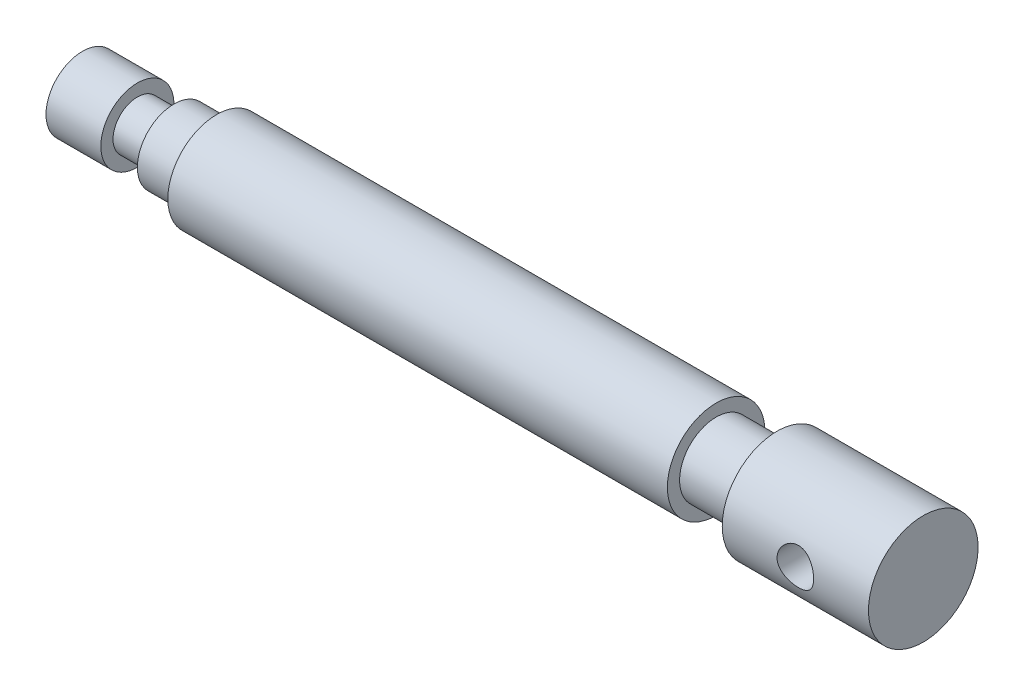
ISO-10303-21;
HEADER;
FILE_DESCRIPTION(('STEP AP214'),'2;1');
FILE_NAME('part.step','',(''),(''),'','','');
FILE_SCHEMA(('AUTOMOTIVE_DESIGN { 1 0 10303 214 1 1 1 1 }'));
ENDSEC;
DATA;
#1=APPLICATION_CONTEXT('core data for automotive mechanical design processes');
#2=APPLICATION_PROTOCOL_DEFINITION('international standard','automotive_design',2000,#1);
#3=PRODUCT_CONTEXT('',#1,'mechanical');
#4=PRODUCT('Part','Part','',(#3));
#5=PRODUCT_RELATED_PRODUCT_CATEGORY('part','',(#4));
#6=PRODUCT_DEFINITION_FORMATION('','',#4);
#7=PRODUCT_DEFINITION_CONTEXT('part definition',#1,'design');
#8=PRODUCT_DEFINITION('design','',#6,#7);
#9=PRODUCT_DEFINITION_SHAPE('','',#8);
#10=(LENGTH_UNIT() NAMED_UNIT(*) SI_UNIT(.MILLI.,.METRE.));
#11=(NAMED_UNIT(*) PLANE_ANGLE_UNIT() SI_UNIT($,.RADIAN.));
#12=(NAMED_UNIT(*) SI_UNIT($,.STERADIAN.) SOLID_ANGLE_UNIT());
#13=UNCERTAINTY_MEASURE_WITH_UNIT(LENGTH_MEASURE(1.E-05),#10,'distance_accuracy_value','');
#14=(GEOMETRIC_REPRESENTATION_CONTEXT(3) GLOBAL_UNCERTAINTY_ASSIGNED_CONTEXT((#13)) GLOBAL_UNIT_ASSIGNED_CONTEXT((#10,
#11,#12)) REPRESENTATION_CONTEXT('',''));
#15=CARTESIAN_POINT('',(0.,0.,0.));
#16=DIRECTION('',(0.,0.,1.));
#17=DIRECTION('',(1.,0.,0.));
#18=AXIS2_PLACEMENT_3D('',#15,#16,#17);
#19=CARTESIAN_POINT('',(69.,0.,0.));
#20=DIRECTION('',(-1.,0.,0.));
#21=DIRECTION('',(0.,0.,1.));
#22=AXIS2_PLACEMENT_3D('',#19,#20,#21);
#23=PLANE('',#22);
#24=CARTESIAN_POINT('',(69.,0.,0.));
#25=DIRECTION('',(-1.,0.,0.));
#26=DIRECTION('',(0.,0.,1.));
#27=AXIS2_PLACEMENT_3D('',#24,#25,#26);
#28=CIRCLE('',#27,9.);
#29=CARTESIAN_POINT('',(69.,0.,9.));
#30=VERTEX_POINT('',#29);
#31=EDGE_CURVE('E49',#30,#30,#28,.T.);
#32=ORIENTED_EDGE('',*,*,#31,.F.);
#33=EDGE_LOOP('',(#32));
#34=FACE_BOUND('',#33,.T.);
#35=ADVANCED_FACE('F35',(#34),#23,.F.);
#36=CARTESIAN_POINT('',(0.,0.,0.));
#37=DIRECTION('',(-1.,0.,0.));
#38=DIRECTION('',(0.,0.,1.));
#39=AXIS2_PLACEMENT_3D('',#36,#37,#38);
#40=CYLINDRICAL_SURFACE('',#39,9.);
#41=CARTESIAN_POINT('',(60.,0.,-9.));
#42=CARTESIAN_POINT('',(60.0000007611949,0.16369008866017,-9.00000045902832));
#43=CARTESIAN_POINT('',(59.9865592016184,0.32737558361565,-8.99549308522634));
#44=CARTESIAN_POINT('',(59.9333126735484,0.649925282618917,-8.97795630609842));
#45=CARTESIAN_POINT('',(59.8935049681532,0.808788984356453,-8.96492601606457));
#46=CARTESIAN_POINT('',(59.7890422698479,1.11699836850533,-8.93175923719327));
#47=CARTESIAN_POINT('',(59.7244288126222,1.2663594776581,-8.9116346319256));
#48=CARTESIAN_POINT('',(59.572376481485,1.55212481041597,-8.86633337152025));
#49=CARTESIAN_POINT('',(59.4849331049922,1.68852647087611,-8.84115572003334));
#50=CARTESIAN_POINT('',(59.2865225854238,1.9492250250668,-8.78742283329015));
#51=CARTESIAN_POINT('',(59.1749062972185,2.07301110089493,-8.75878669391354));
#52=CARTESIAN_POINT('',(58.9326985358803,2.30049807810625,-8.70180944349364));
#53=CARTESIAN_POINT('',(58.8021028952145,2.40419455646839,-8.67346839871647));
#54=CARTESIAN_POINT('',(58.5210446544106,2.59147482668358,-8.61939997431821));
#55=CARTESIAN_POINT('',(58.3701187808036,2.6743945746631,-8.59377117827064));
#56=CARTESIAN_POINT('',(58.0554717166244,2.81345662163317,-8.54925916255803));
#57=CARTESIAN_POINT('',(57.8917544485118,2.8696070921603,-8.53037388482237));
#58=CARTESIAN_POINT('',(57.5619803355099,2.95162038452749,-8.50233909808131));
#59=CARTESIAN_POINT('',(57.3961883745328,2.97844034481531,-8.49288287308833));
#60=CARTESIAN_POINT('',(57.0622087375324,3.00402337000343,-8.48386969888522));
#61=CARTESIAN_POINT('',(56.8940218178724,3.00279510481416,-8.4843096906819));
#62=CARTESIAN_POINT('',(56.5681901086679,2.97305971111026,-8.4947704502454));
#63=CARTESIAN_POINT('',(56.4104147912429,2.94580173950099,-8.50435247602598));
#64=CARTESIAN_POINT('',(56.1018197411795,2.86681848854825,-8.53129973173652));
#65=CARTESIAN_POINT('',(55.9510008436948,2.81509027977561,-8.54866589352322));
#66=CARTESIAN_POINT('',(55.6577617512256,2.68781717418064,-8.58953733393746));
#67=CARTESIAN_POINT('',(55.5155159235914,2.61190214612179,-8.61313697379351));
#68=CARTESIAN_POINT('',(55.2453872751608,2.43866731890942,-8.66377675727179));
#69=CARTESIAN_POINT('',(55.1175086191999,2.34134133709202,-8.6908178937139));
#70=CARTESIAN_POINT('',(54.8727252055177,2.12204799804671,-8.74701987503222));
#71=CARTESIAN_POINT('',(54.7567419164728,1.99905945022893,-8.77621768064528));
#72=CARTESIAN_POINT('',(54.5468062000098,1.73501870991019,-8.8322081516111));
#73=CARTESIAN_POINT('',(54.4528558855065,1.59396478698245,-8.85900058614202));
#74=CARTESIAN_POINT('',(54.2889110992948,1.29584283913881,-8.90751323813381));
#75=CARTESIAN_POINT('',(54.2191635259778,1.13862982924901,-8.92918050024117));
#76=CARTESIAN_POINT('',(54.1073904781329,0.813807250093527,-8.96461701433304));
#77=CARTESIAN_POINT('',(54.0653553737297,0.646201314464864,-8.97838900964637));
#78=CARTESIAN_POINT('',(54.0118330019329,0.313151488587914,-8.99602881214321));
#79=CARTESIAN_POINT('',(53.9991005724818,0.14792879959454,-9.00030005501184));
#80=CARTESIAN_POINT('',(54.0009980207954,-0.182325209880711,-8.99966708084482));
#81=CARTESIAN_POINT('',(54.0156232799396,-0.347356557958951,-8.99476441258087));
#82=CARTESIAN_POINT('',(54.0708357232079,-0.667559598912766,-8.97660074151313));
#83=CARTESIAN_POINT('',(54.1106586181485,-0.82287842050453,-8.96358596133577));
#84=CARTESIAN_POINT('',(54.2141803334002,-1.12456787573872,-8.9307554049021));
#85=CARTESIAN_POINT('',(54.2778821984034,-1.27093736552582,-8.91093876140025));
#86=CARTESIAN_POINT('',(54.4292112955224,-1.55486488917982,-8.86586793861869));
#87=CARTESIAN_POINT('',(54.5174237798495,-1.69208987765144,-8.84048444267358));
#88=CARTESIAN_POINT('',(54.7145824500405,-1.95019449040676,-8.78715761748787));
#89=CARTESIAN_POINT('',(54.8235349680953,-2.07106910338673,-8.75921350781482));
#90=CARTESIAN_POINT('',(55.0649362530198,-2.2987575234189,-8.70230543941334));
#91=CARTESIAN_POINT('',(55.1982276807806,-2.40468290773731,-8.67335283262283));
#92=CARTESIAN_POINT('',(55.4813147034327,-2.59277256697072,-8.61899919884126));
#93=CARTESIAN_POINT('',(55.6311104359022,-2.67493664379304,-8.59359820146007));
#94=CARTESIAN_POINT('',(55.9430190458697,-2.81279079124908,-8.5494717537415));
#95=CARTESIAN_POINT('',(56.1051062375063,-2.86853439649506,-8.53073282378936));
#96=CARTESIAN_POINT('',(56.4371359501324,-2.95168400027807,-8.50232496919348));
#97=CARTESIAN_POINT('',(56.6070748962131,-2.97910276486182,-8.49265195870918));
#98=CARTESIAN_POINT('',(56.9405912881228,-3.00382884743203,-8.48393576622531));
#99=CARTESIAN_POINT('',(57.1040470208605,-3.0026107719252,-8.48437200772245));
#100=CARTESIAN_POINT('',(57.4282952247662,-2.97372688034608,-8.49453809471602));
#101=CARTESIAN_POINT('',(57.5890878538653,-2.94606263837576,-8.50426738708084));
#102=CARTESIAN_POINT('',(57.9004069890074,-2.86611543938804,-8.53153572914675));
#103=CARTESIAN_POINT('',(58.0510704750135,-2.81431003804654,-8.54892294067432));
#104=CARTESIAN_POINT('',(58.3416822208148,-2.68793809727924,-8.58949196455405));
#105=CARTESIAN_POINT('',(58.481628093564,-2.61336650566142,-8.61267506290179));
#106=CARTESIAN_POINT('',(58.7534510097687,-2.43978207775029,-8.66348487678138));
#107=CARTESIAN_POINT('',(58.8847095056952,-2.33984472829374,-8.69126134926411));
#108=CARTESIAN_POINT('',(59.1290694401526,-2.11992864940694,-8.74750068849758));
#109=CARTESIAN_POINT('',(59.2421657270642,-1.99994425335444,-8.77596374737117));
#110=CARTESIAN_POINT('',(59.4514332368675,-1.73772467076207,-8.83170091576632));
#111=CARTESIAN_POINT('',(59.546773043253,-1.59480454049919,-8.8588854540377));
#112=CARTESIAN_POINT('',(59.711971286552,-1.29407207221988,-8.90777973517836));
#113=CARTESIAN_POINT('',(59.7818362377661,-1.13626355439705,-8.92949087723789));
#114=CARTESIAN_POINT('',(59.891164897466,-0.817480941602932,-8.96416545205625));
#115=CARTESIAN_POINT('',(59.9318473987901,-0.656963273029229,-8.97747637267568));
#116=CARTESIAN_POINT('',(59.9862608420314,-0.330961248030742,-8.99539221192665));
#117=CARTESIAN_POINT('',(59.9999992304896,-0.16547827670624,-8.99999953595714));
#118=CARTESIAN_POINT('',(60.,0.,-9.));
#119=B_SPLINE_CURVE_WITH_KNOTS('',3,(#41,#42,#43,#44,#45,#46,#47,#48,#49,#50,#51,#52,#53,#54,
#55,#56,#57,#58,#59,#60,#61,#62,#63,#64,#65,#66,#67,#68,#69,#70,#71,#72,#73,#74,#75,#76,#77,#78,
#79,#80,#81,#82,#83,#84,#85,#86,#87,#88,#89,#90,#91,#92,#93,#94,#95,#96,#97,#98,#99,#100,#101,
#102,#103,#104,#105,#106,#107,#108,#109,#110,#111,#112,#113,#114,#115,#116,#117,#118),
.UNSPECIFIED.,.T.,.F.,(4,2,2,2,2,2,2,2,2,2,2,2,2,2,2,2,2,2,2,2,2,2,2,2,2,2,2,2,2,2,2,2,2,2,2,2,
2,2,4),(0.,0.490461318078033,0.980973555802562,1.47066801861082,1.9604591333973,
2.46554052848268,2.97073299862591,3.49045154470412,4.010011340785,4.51205777225521,
5.01394901962457,5.49290479653841,5.97191792566446,6.45864513465392,6.94551307674622,
7.45779917434101,7.97013437899855,8.48755216951072,9.00479006631625,9.49960749525509,
9.9943413949253,10.4747447393464,10.9552093585231,11.4483119953121,11.9415654246567,
12.4572306864226,12.9729002470499,13.4875204148031,14.0019085411752,14.4898699819278,
14.9778023805413,15.4564676124125,15.9352391452793,16.4349020007541,16.9347063337134,
17.453989825053,17.9731404345737,18.4690967512144,18.9649159811442),.UNSPECIFIED.);
#120=CARTESIAN_POINT('',(60.,0.,-9.));
#121=VERTEX_POINT('',#120);
#122=EDGE_CURVE('E10',#121,#121,#119,.T.);
#123=ORIENTED_EDGE('',*,*,#122,.T.);
#124=EDGE_LOOP('',(#123));
#125=FACE_BOUND('',#124,.T.);
#126=CARTESIAN_POINT('',(60.,0.,9.));
#127=CARTESIAN_POINT('',(60.0000007611949,-0.16369008866017,9.00000045902832));
#128=CARTESIAN_POINT('',(59.9865592016184,-0.327375583615649,8.99549308522634));
#129=CARTESIAN_POINT('',(59.9333126735484,-0.649925282618916,8.97795630609842));
#130=CARTESIAN_POINT('',(59.8935049681532,-0.808788984356453,8.96492601606457));
#131=CARTESIAN_POINT('',(59.7890422698479,-1.11699836850533,8.93175923719328));
#132=CARTESIAN_POINT('',(59.7244288126222,-1.2663594776581,8.9116346319256));
#133=CARTESIAN_POINT('',(59.572376481485,-1.55212481041597,8.86633337152025));
#134=CARTESIAN_POINT('',(59.4849331049922,-1.68852647087611,8.84115572003334));
#135=CARTESIAN_POINT('',(59.2865225854238,-1.9492250250668,8.78742283329015));
#136=CARTESIAN_POINT('',(59.1749062972185,-2.07301110089493,8.75878669391354));
#137=CARTESIAN_POINT('',(58.9326985358803,-2.30049807810625,8.70180944349364));
#138=CARTESIAN_POINT('',(58.8021028952145,-2.40419455646839,8.67346839871647));
#139=CARTESIAN_POINT('',(58.5210446544106,-2.59147482668358,8.61939997431821));
#140=CARTESIAN_POINT('',(58.3701187808036,-2.6743945746631,8.59377117827064));
#141=CARTESIAN_POINT('',(58.0554717166244,-2.81345662163317,8.54925916255803));
#142=CARTESIAN_POINT('',(57.8917544485118,-2.8696070921603,8.53037388482237));
#143=CARTESIAN_POINT('',(57.5619803355099,-2.95162038452749,8.50233909808131));
#144=CARTESIAN_POINT('',(57.3961883745328,-2.97844034481531,8.49288287308833));
#145=CARTESIAN_POINT('',(57.0622087375324,-3.00402337000343,8.48386969888522));
#146=CARTESIAN_POINT('',(56.8940218178724,-3.00279510481416,8.4843096906819));
#147=CARTESIAN_POINT('',(56.5681901086679,-2.97305971111026,8.4947704502454));
#148=CARTESIAN_POINT('',(56.4104147912429,-2.94580173950099,8.50435247602598));
#149=CARTESIAN_POINT('',(56.1018197411795,-2.86681848854825,8.53129973173652));
#150=CARTESIAN_POINT('',(55.9510008436948,-2.81509027977561,8.54866589352322));
#151=CARTESIAN_POINT('',(55.6577617512256,-2.68781717418064,8.58953733393746));
#152=CARTESIAN_POINT('',(55.5155159235914,-2.61190214612179,8.61313697379351));
#153=CARTESIAN_POINT('',(55.2453872751608,-2.43866731890942,8.66377675727179));
#154=CARTESIAN_POINT('',(55.1175086191999,-2.34134133709202,8.6908178937139));
#155=CARTESIAN_POINT('',(54.8727252055177,-2.12204799804671,8.74701987503222));
#156=CARTESIAN_POINT('',(54.7567419164728,-1.99905945022893,8.77621768064528));
#157=CARTESIAN_POINT('',(54.5468062000098,-1.73501870991019,8.8322081516111));
#158=CARTESIAN_POINT('',(54.4528558855065,-1.59396478698245,8.85900058614202));
#159=CARTESIAN_POINT('',(54.2889110992948,-1.29584283913881,8.90751323813381));
#160=CARTESIAN_POINT('',(54.2191635259778,-1.13862982924901,8.92918050024117));
#161=CARTESIAN_POINT('',(54.1073904781329,-0.813807250093527,8.96461701433304));
#162=CARTESIAN_POINT('',(54.0653553737297,-0.646201314464865,8.97838900964637));
#163=CARTESIAN_POINT('',(54.0118330019329,-0.313151488587915,8.99602881214321));
#164=CARTESIAN_POINT('',(53.9991005724818,-0.147928799594541,9.00030005501184));
#165=CARTESIAN_POINT('',(54.0009980207954,0.182325209880711,8.99966708084482));
#166=CARTESIAN_POINT('',(54.0156232799396,0.34735655795895,8.99476441258087));
#167=CARTESIAN_POINT('',(54.0708357232079,0.667559598912765,8.97660074151313));
#168=CARTESIAN_POINT('',(54.1106586181485,0.822878420504529,8.96358596133577));
#169=CARTESIAN_POINT('',(54.2141803334002,1.12456787573872,8.9307554049021));
#170=CARTESIAN_POINT('',(54.2778821984034,1.27093736552582,8.91093876140025));
#171=CARTESIAN_POINT('',(54.4292112955224,1.55486488917982,8.86586793861869));
#172=CARTESIAN_POINT('',(54.5174237798495,1.69208987765144,8.84048444267358));
#173=CARTESIAN_POINT('',(54.7145824500405,1.95019449040676,8.78715761748787));
#174=CARTESIAN_POINT('',(54.8235349680953,2.07106910338673,8.75921350781483));
#175=CARTESIAN_POINT('',(55.0649362530198,2.2987575234189,8.70230543941334));
#176=CARTESIAN_POINT('',(55.1982276807806,2.40468290773731,8.67335283262283));
#177=CARTESIAN_POINT('',(55.4813147034327,2.59277256697072,8.61899919884126));
#178=CARTESIAN_POINT('',(55.6311104359022,2.67493664379304,8.59359820146007));
#179=CARTESIAN_POINT('',(55.9430190458697,2.81279079124908,8.5494717537415));
#180=CARTESIAN_POINT('',(56.1051062375063,2.86853439649506,8.53073282378936));
#181=CARTESIAN_POINT('',(56.4371359501324,2.95168400027807,8.50232496919348));
#182=CARTESIAN_POINT('',(56.6070748962131,2.97910276486182,8.49265195870918));
#183=CARTESIAN_POINT('',(56.9405912881228,3.00382884743203,8.48393576622531));
#184=CARTESIAN_POINT('',(57.1040470208605,3.0026107719252,8.48437200772245));
#185=CARTESIAN_POINT('',(57.4282952247662,2.97372688034608,8.49453809471602));
#186=CARTESIAN_POINT('',(57.5890878538653,2.94606263837576,8.50426738708084));
#187=CARTESIAN_POINT('',(57.9004069890074,2.86611543938804,8.53153572914675));
#188=CARTESIAN_POINT('',(58.0510704750135,2.81431003804654,8.54892294067432));
#189=CARTESIAN_POINT('',(58.3416822208148,2.68793809727924,8.58949196455405));
#190=CARTESIAN_POINT('',(58.481628093564,2.61336650566142,8.61267506290179));
#191=CARTESIAN_POINT('',(58.7534510097687,2.43978207775029,8.66348487678138));
#192=CARTESIAN_POINT('',(58.8847095056952,2.33984472829374,8.69126134926411));
#193=CARTESIAN_POINT('',(59.1290694401526,2.11992864940694,8.74750068849758));
#194=CARTESIAN_POINT('',(59.2421657270642,1.99994425335444,8.77596374737117));
#195=CARTESIAN_POINT('',(59.4514332368675,1.73772467076207,8.83170091576632));
#196=CARTESIAN_POINT('',(59.546773043253,1.59480454049919,8.8588854540377));
#197=CARTESIAN_POINT('',(59.711971286552,1.29407207221988,8.90777973517836));
#198=CARTESIAN_POINT('',(59.7818362377661,1.13626355439705,8.92949087723789));
#199=CARTESIAN_POINT('',(59.891164897466,0.817480941602932,8.96416545205625));
#200=CARTESIAN_POINT('',(59.9318473987901,0.656963273029229,8.97747637267568));
#201=CARTESIAN_POINT('',(59.9862608420314,0.330961248030742,8.99539221192665));
#202=CARTESIAN_POINT('',(59.9999992304896,0.16547827670624,8.99999953595715));
#203=CARTESIAN_POINT('',(60.,0.,9.));
#204=B_SPLINE_CURVE_WITH_KNOTS('',3,(#126,#127,#128,#129,#130,#131,#132,#133,#134,#135,#136,
#137,#138,#139,#140,#141,#142,#143,#144,#145,#146,#147,#148,#149,#150,#151,#152,#153,#154,#155,
#156,#157,#158,#159,#160,#161,#162,#163,#164,#165,#166,#167,#168,#169,#170,#171,#172,#173,#174,
#175,#176,#177,#178,#179,#180,#181,#182,#183,#184,#185,#186,#187,#188,#189,#190,#191,#192,#193,
#194,#195,#196,#197,#198,#199,#200,#201,#202,#203),.UNSPECIFIED.,.T.,.F.,(4,2,2,2,2,2,2,2,2,2,2,
2,2,2,2,2,2,2,2,2,2,2,2,2,2,2,2,2,2,2,2,2,2,2,2,2,2,2,4),(0.,0.490461318078033,
0.980973555802562,1.47066801861082,1.9604591333973,2.46554052848268,2.97073299862591,
3.49045154470412,4.010011340785,4.51205777225521,5.01394901962457,5.49290479653841,
5.97191792566446,6.45864513465392,6.94551307674622,7.45779917434101,7.97013437899855,
8.48755216951073,9.00479006631625,9.49960749525509,9.9943413949253,10.4747447393464,
10.9552093585231,11.4483119953121,11.9415654246567,12.4572306864226,12.9729002470499,
13.4875204148031,14.0019085411752,14.4898699819278,14.9778023805413,15.4564676124125,
15.9352391452793,16.4349020007541,16.9347063337134,17.453989825053,17.9731404345737,
18.4690967512144,18.9649159811442),.UNSPECIFIED.);
#205=CARTESIAN_POINT('',(60.,0.,9.));
#206=VERTEX_POINT('',#205);
#207=EDGE_CURVE('E45',#206,#206,#204,.T.);
#208=ORIENTED_EDGE('',*,*,#207,.T.);
#209=EDGE_LOOP('',(#208));
#210=FACE_BOUND('',#209,.T.);
#211=CARTESIAN_POINT('',(45.,0.,0.));
#212=DIRECTION('',(-1.,0.,0.));
#213=DIRECTION('',(0.,0.,1.));
#214=AXIS2_PLACEMENT_3D('',#211,#212,#213);
#215=CIRCLE('',#214,9.);
#216=CARTESIAN_POINT('',(45.,0.,9.));
#217=VERTEX_POINT('',#216);
#218=EDGE_CURVE('E53',#217,#217,#215,.T.);
#219=ORIENTED_EDGE('',*,*,#218,.F.);
#220=EDGE_LOOP('',(#219));
#221=FACE_BOUND('',#220,.T.);
#222=ORIENTED_EDGE('',*,*,#31,.T.);
#223=EDGE_LOOP('',(#222));
#224=FACE_BOUND('',#223,.T.);
#225=ADVANCED_FACE('F59',(#125,#210,#221,#224),#40,.T.);
#226=CARTESIAN_POINT('',(45.,0.,-9.));
#227=DIRECTION('',(1.,0.,0.));
#228=DIRECTION('',(0.,0.,-1.));
#229=AXIS2_PLACEMENT_3D('',#226,#227,#228);
#230=PLANE('',#229);
#231=CARTESIAN_POINT('',(45.,0.,0.));
#232=DIRECTION('',(-1.,0.,0.));
#233=DIRECTION('',(0.,0.,1.));
#234=AXIS2_PLACEMENT_3D('',#231,#232,#233);
#235=CIRCLE('',#234,6.);
#236=CARTESIAN_POINT('',(45.,0.,6.));
#237=VERTEX_POINT('',#236);
#238=EDGE_CURVE('E230',#237,#237,#235,.T.);
#239=ORIENTED_EDGE('',*,*,#238,.F.);
#240=EDGE_LOOP('',(#239));
#241=FACE_BOUND('',#240,.T.);
#242=ORIENTED_EDGE('',*,*,#218,.T.);
#243=EDGE_LOOP('',(#242));
#244=FACE_BOUND('',#243,.T.);
#245=ADVANCED_FACE('F106',(#241,#244),#230,.F.);
#246=CARTESIAN_POINT('',(0.,0.,0.));
#247=DIRECTION('',(-1.,0.,0.));
#248=DIRECTION('',(0.,0.,1.));
#249=AXIS2_PLACEMENT_3D('',#246,#247,#248);
#250=CYLINDRICAL_SURFACE('',#249,6.);
#251=CARTESIAN_POINT('',(35.,0.,0.));
#252=DIRECTION('',(-1.,0.,0.));
#253=DIRECTION('',(0.,0.,1.));
#254=AXIS2_PLACEMENT_3D('',#251,#252,#253);
#255=CIRCLE('',#254,6.);
#256=CARTESIAN_POINT('',(35.,0.,6.));
#257=VERTEX_POINT('',#256);
#258=EDGE_CURVE('E234',#257,#257,#255,.T.);
#259=ORIENTED_EDGE('',*,*,#258,.F.);
#260=EDGE_LOOP('',(#259));
#261=FACE_BOUND('',#260,.T.);
#262=ORIENTED_EDGE('',*,*,#238,.T.);
#263=EDGE_LOOP('',(#262));
#264=FACE_BOUND('',#263,.T.);
#265=ADVANCED_FACE('F103',(#261,#264),#250,.T.);
#266=CARTESIAN_POINT('',(35.,0.,-6.));
#267=DIRECTION('',(-1.,0.,0.));
#268=DIRECTION('',(0.,0.,1.));
#269=AXIS2_PLACEMENT_3D('',#266,#267,#268);
#270=PLANE('',#269);
#271=CARTESIAN_POINT('',(35.,0.,0.));
#272=DIRECTION('',(-1.,0.,0.));
#273=DIRECTION('',(0.,0.,1.));
#274=AXIS2_PLACEMENT_3D('',#271,#272,#273);
#275=CIRCLE('',#274,8.);
#276=CARTESIAN_POINT('',(35.,0.,8.));
#277=VERTEX_POINT('',#276);
#278=EDGE_CURVE('E239',#277,#277,#275,.T.);
#279=ORIENTED_EDGE('',*,*,#278,.F.);
#280=EDGE_LOOP('',(#279));
#281=FACE_BOUND('',#280,.T.);
#282=ORIENTED_EDGE('',*,*,#258,.T.);
#283=EDGE_LOOP('',(#282));
#284=FACE_BOUND('',#283,.T.);
#285=ADVANCED_FACE('F99',(#281,#284),#270,.F.);
#286=CARTESIAN_POINT('',(0.,0.,0.));
#287=DIRECTION('',(-1.,0.,0.));
#288=DIRECTION('',(0.,0.,1.));
#289=AXIS2_PLACEMENT_3D('',#286,#287,#288);
#290=CYLINDRICAL_SURFACE('',#289,7.99999999999999);
#291=CARTESIAN_POINT('',(-47.,0.,0.));
#292=DIRECTION('',(-1.,0.,0.));
#293=DIRECTION('',(0.,0.,1.));
#294=AXIS2_PLACEMENT_3D('',#291,#292,#293);
#295=CIRCLE('',#294,7.99999999999999);
#296=CARTESIAN_POINT('',(-47.,0.,7.99999999999999));
#297=VERTEX_POINT('',#296);
#298=EDGE_CURVE('E242',#297,#297,#295,.T.);
#299=ORIENTED_EDGE('',*,*,#298,.F.);
#300=EDGE_LOOP('',(#299));
#301=FACE_BOUND('',#300,.T.);
#302=ORIENTED_EDGE('',*,*,#278,.T.);
#303=EDGE_LOOP('',(#302));
#304=FACE_BOUND('',#303,.T.);
#305=ADVANCED_FACE('F95',(#301,#304),#290,.T.);
#306=CARTESIAN_POINT('',(-47.,0.,-7.99999999999999));
#307=DIRECTION('',(1.,0.,0.));
#308=DIRECTION('',(0.,0.,-1.));
#309=AXIS2_PLACEMENT_3D('',#306,#307,#308);
#310=PLANE('',#309);
#311=CARTESIAN_POINT('',(-47.,0.,0.));
#312=DIRECTION('',(-1.,0.,0.));
#313=DIRECTION('',(0.,0.,1.));
#314=AXIS2_PLACEMENT_3D('',#311,#312,#313);
#315=CIRCLE('',#314,6.);
#316=CARTESIAN_POINT('',(-47.,0.,6.));
#317=VERTEX_POINT('',#316);
#318=EDGE_CURVE('E245',#317,#317,#315,.T.);
#319=ORIENTED_EDGE('',*,*,#318,.F.);
#320=EDGE_LOOP('',(#319));
#321=FACE_BOUND('',#320,.T.);
#322=ORIENTED_EDGE('',*,*,#298,.T.);
#323=EDGE_LOOP('',(#322));
#324=FACE_BOUND('',#323,.T.);
#325=ADVANCED_FACE('F91',(#321,#324),#310,.F.);
#326=CARTESIAN_POINT('',(0.,0.,0.));
#327=DIRECTION('',(-1.,0.,0.));
#328=DIRECTION('',(0.,0.,1.));
#329=AXIS2_PLACEMENT_3D('',#326,#327,#328);
#330=CYLINDRICAL_SURFACE('',#329,6.);
#331=CARTESIAN_POINT('',(-54.,0.,0.));
#332=DIRECTION('',(-1.,0.,0.));
#333=DIRECTION('',(0.,0.,1.));
#334=AXIS2_PLACEMENT_3D('',#331,#332,#333);
#335=CIRCLE('',#334,6.);
#336=CARTESIAN_POINT('',(-54.,0.,6.));
#337=VERTEX_POINT('',#336);
#338=EDGE_CURVE('E248',#337,#337,#335,.T.);
#339=ORIENTED_EDGE('',*,*,#338,.F.);
#340=EDGE_LOOP('',(#339));
#341=FACE_BOUND('',#340,.T.);
#342=ORIENTED_EDGE('',*,*,#318,.T.);
#343=EDGE_LOOP('',(#342));
#344=FACE_BOUND('',#343,.T.);
#345=ADVANCED_FACE('F87',(#341,#344),#330,.T.);
#346=CARTESIAN_POINT('',(-54.,0.,-6.));
#347=DIRECTION('',(1.,0.,0.));
#348=DIRECTION('',(0.,0.,-1.));
#349=AXIS2_PLACEMENT_3D('',#346,#347,#348);
#350=PLANE('',#349);
#351=CARTESIAN_POINT('',(-54.,0.,0.));
#352=DIRECTION('',(-1.,0.,0.));
#353=DIRECTION('',(0.,0.,1.));
#354=AXIS2_PLACEMENT_3D('',#351,#352,#353);
#355=CIRCLE('',#354,4.);
#356=CARTESIAN_POINT('',(-54.,0.,4.));
#357=VERTEX_POINT('',#356);
#358=EDGE_CURVE('E251',#357,#357,#355,.T.);
#359=ORIENTED_EDGE('',*,*,#358,.F.);
#360=EDGE_LOOP('',(#359));
#361=FACE_BOUND('',#360,.T.);
#362=ORIENTED_EDGE('',*,*,#338,.T.);
#363=EDGE_LOOP('',(#362));
#364=FACE_BOUND('',#363,.T.);
#365=ADVANCED_FACE('F83',(#361,#364),#350,.F.);
#366=CARTESIAN_POINT('',(0.,0.,0.));
#367=DIRECTION('',(-1.,0.,0.));
#368=DIRECTION('',(0.,0.,1.));
#369=AXIS2_PLACEMENT_3D('',#366,#367,#368);
#370=CYLINDRICAL_SURFACE('',#369,4.);
#371=CARTESIAN_POINT('',(-60.,0.,0.));
#372=DIRECTION('',(-1.,0.,0.));
#373=DIRECTION('',(0.,0.,1.));
#374=AXIS2_PLACEMENT_3D('',#371,#372,#373);
#375=CIRCLE('',#374,4.);
#376=CARTESIAN_POINT('',(-60.,0.,4.));
#377=VERTEX_POINT('',#376);
#378=EDGE_CURVE('E254',#377,#377,#375,.T.);
#379=ORIENTED_EDGE('',*,*,#378,.F.);
#380=EDGE_LOOP('',(#379));
#381=FACE_BOUND('',#380,.T.);
#382=ORIENTED_EDGE('',*,*,#358,.T.);
#383=EDGE_LOOP('',(#382));
#384=FACE_BOUND('',#383,.T.);
#385=ADVANCED_FACE('F79',(#381,#384),#370,.T.);
#386=CARTESIAN_POINT('',(-60.,0.,-4.));
#387=DIRECTION('',(-1.,0.,0.));
#388=DIRECTION('',(0.,0.,1.));
#389=AXIS2_PLACEMENT_3D('',#386,#387,#388);
#390=PLANE('',#389);
#391=CARTESIAN_POINT('',(-60.,0.,0.));
#392=DIRECTION('',(-1.,0.,0.));
#393=DIRECTION('',(0.,0.,1.));
#394=AXIS2_PLACEMENT_3D('',#391,#392,#393);
#395=CIRCLE('',#394,6.);
#396=CARTESIAN_POINT('',(-60.,0.,6.));
#397=VERTEX_POINT('',#396);
#398=EDGE_CURVE('E257',#397,#397,#395,.T.);
#399=ORIENTED_EDGE('',*,*,#398,.F.);
#400=EDGE_LOOP('',(#399));
#401=FACE_BOUND('',#400,.T.);
#402=ORIENTED_EDGE('',*,*,#378,.T.);
#403=EDGE_LOOP('',(#402));
#404=FACE_BOUND('',#403,.T.);
#405=ADVANCED_FACE('F75',(#401,#404),#390,.F.);
#406=CARTESIAN_POINT('',(0.,0.,0.));
#407=DIRECTION('',(-1.,0.,0.));
#408=DIRECTION('',(0.,0.,1.));
#409=AXIS2_PLACEMENT_3D('',#406,#407,#408);
#410=CYLINDRICAL_SURFACE('',#409,6.);
#411=CARTESIAN_POINT('',(-69.,0.,0.));
#412=DIRECTION('',(-1.,0.,0.));
#413=DIRECTION('',(0.,0.,1.));
#414=AXIS2_PLACEMENT_3D('',#411,#412,#413);
#415=CIRCLE('',#414,6.);
#416=CARTESIAN_POINT('',(-69.,0.,6.));
#417=VERTEX_POINT('',#416);
#418=EDGE_CURVE('E260',#417,#417,#415,.T.);
#419=ORIENTED_EDGE('',*,*,#418,.F.);
#420=EDGE_LOOP('',(#419));
#421=FACE_BOUND('',#420,.T.);
#422=ORIENTED_EDGE('',*,*,#398,.T.);
#423=EDGE_LOOP('',(#422));
#424=FACE_BOUND('',#423,.T.);
#425=ADVANCED_FACE('F71',(#421,#424),#410,.T.);
#426=CARTESIAN_POINT('',(-69.,0.,-6.));
#427=DIRECTION('',(1.,0.,0.));
#428=DIRECTION('',(0.,0.,-1.));
#429=AXIS2_PLACEMENT_3D('',#426,#427,#428);
#430=PLANE('',#429);
#431=ORIENTED_EDGE('',*,*,#418,.T.);
#432=EDGE_LOOP('',(#431));
#433=FACE_BOUND('',#432,.T.);
#434=ADVANCED_FACE('F66',(#433),#430,.F.);
#435=CARTESIAN_POINT('',(57.,0.,-9.));
#436=DIRECTION('',(0.,0.,1.));
#437=DIRECTION('',(1.,0.,0.));
#438=AXIS2_PLACEMENT_3D('',#435,#436,#437);
#439=CYLINDRICAL_SURFACE('',#438,3.);
#440=ORIENTED_EDGE('',*,*,#207,.F.);
#441=EDGE_LOOP('',(#440));
#442=FACE_BOUND('',#441,.T.);
#443=ORIENTED_EDGE('',*,*,#122,.F.);
#444=EDGE_LOOP('',(#443));
#445=FACE_BOUND('',#444,.T.);
#446=ADVANCED_FACE('F62',(#442,#445),#439,.F.);
#447=CLOSED_SHELL('',(#35,#225,#245,#265,#285,#305,#325,#345,#365,#385,#405,#425,#434,#446));
#448=MANIFOLD_SOLID_BREP('B2',#447);
#449=ADVANCED_BREP_SHAPE_REPRESENTATION('',(#18,#448),#14);
#450=SHAPE_DEFINITION_REPRESENTATION(#9,#449);
ENDSEC;
END-ISO-10303-21;
